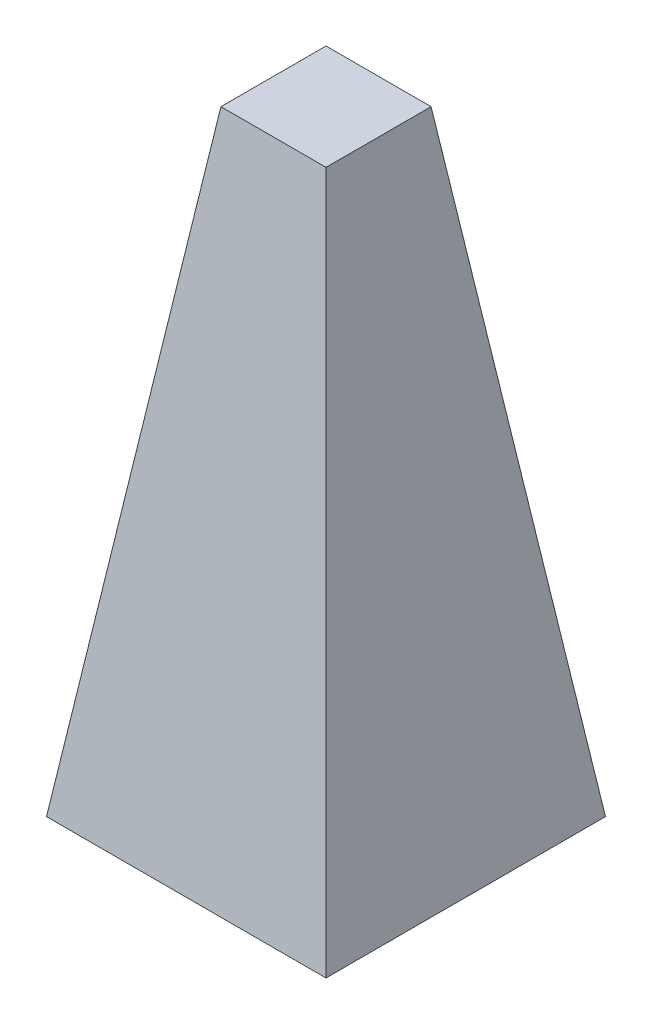
ISO-10303-21;
HEADER;
FILE_DESCRIPTION(('STEP AP214'),'2;1');
FILE_NAME('part.step','',(''),(''),'','','');
FILE_SCHEMA(('AUTOMOTIVE_DESIGN { 1 0 10303 214 1 1 1 1 }'));
ENDSEC;
DATA;
#1=APPLICATION_CONTEXT('core data for automotive mechanical design processes');
#2=APPLICATION_PROTOCOL_DEFINITION('international standard','automotive_design',2000,#1);
#3=PRODUCT_CONTEXT('',#1,'mechanical');
#4=PRODUCT('Part','Part','',(#3));
#5=PRODUCT_RELATED_PRODUCT_CATEGORY('part','',(#4));
#6=PRODUCT_DEFINITION_FORMATION('','',#4);
#7=PRODUCT_DEFINITION_CONTEXT('part definition',#1,'design');
#8=PRODUCT_DEFINITION('design','',#6,#7);
#9=PRODUCT_DEFINITION_SHAPE('','',#8);
#10=(LENGTH_UNIT() NAMED_UNIT(*) SI_UNIT(.MILLI.,.METRE.));
#11=(NAMED_UNIT(*) PLANE_ANGLE_UNIT() SI_UNIT($,.RADIAN.));
#12=(NAMED_UNIT(*) SI_UNIT($,.STERADIAN.) SOLID_ANGLE_UNIT());
#13=UNCERTAINTY_MEASURE_WITH_UNIT(LENGTH_MEASURE(1.E-05),#10,'distance_accuracy_value','');
#14=(GEOMETRIC_REPRESENTATION_CONTEXT(3) GLOBAL_UNCERTAINTY_ASSIGNED_CONTEXT((#13)) GLOBAL_UNIT_ASSIGNED_CONTEXT((#10,
#11,#12)) REPRESENTATION_CONTEXT('',''));
#15=CARTESIAN_POINT('',(0.,0.,0.));
#16=DIRECTION('',(0.,0.,1.));
#17=DIRECTION('',(1.,0.,0.));
#18=AXIS2_PLACEMENT_3D('',#15,#16,#17);
#19=CARTESIAN_POINT('',(0.,279.4,0.));
#20=DIRECTION('',(0.,-1.,0.));
#21=DIRECTION('',(0.,0.,-1.));
#22=AXIS2_PLACEMENT_3D('',#19,#20,#21);
#23=PLANE('',#22);
#24=DIRECTION('',(0.,0.,-1.));
#25=VECTOR('',#24,1.);
#26=CARTESIAN_POINT('',(23.876,279.4,23.876));
#27=LINE('',#26,#25);
#28=CARTESIAN_POINT('',(23.876,279.4,23.876));
#29=VERTEX_POINT('',#28);
#30=CARTESIAN_POINT('',(23.876,279.4,-23.876));
#31=VERTEX_POINT('',#30);
#32=EDGE_CURVE('E231',#29,#31,#27,.T.);
#33=ORIENTED_EDGE('',*,*,#32,.T.);
#34=DIRECTION('',(-1.,0.,0.));
#35=VECTOR('',#34,1.);
#36=CARTESIAN_POINT('',(-23.876,279.4,-23.876));
#37=LINE('',#36,#35);
#38=CARTESIAN_POINT('',(-23.876,279.4,-23.876));
#39=VERTEX_POINT('',#38);
#40=EDGE_CURVE('E225',#31,#39,#37,.T.);
#41=ORIENTED_EDGE('',*,*,#40,.T.);
#42=DIRECTION('',(0.,0.,1.));
#43=VECTOR('',#42,1.);
#44=CARTESIAN_POINT('',(-23.876,279.4,23.876));
#45=LINE('',#44,#43);
#46=CARTESIAN_POINT('',(-23.876,279.4,23.876));
#47=VERTEX_POINT('',#46);
#48=EDGE_CURVE('E60',#39,#47,#45,.T.);
#49=ORIENTED_EDGE('',*,*,#48,.T.);
#50=DIRECTION('',(1.,0.,0.));
#51=VECTOR('',#50,1.);
#52=CARTESIAN_POINT('',(-23.876,279.4,23.876));
#53=LINE('',#52,#51);
#54=EDGE_CURVE('E12',#47,#29,#53,.T.);
#55=ORIENTED_EDGE('',*,*,#54,.T.);
#56=EDGE_LOOP('',(#33,#41,#49,#55));
#57=FACE_BOUND('',#56,.T.);
#58=ADVANCED_FACE('F49',(#57),#23,.F.);
#59=CARTESIAN_POINT('',(0.,0.,0.));
#60=DIRECTION('',(0.,-1.,0.));
#61=DIRECTION('',(0.,0.,-1.));
#62=AXIS2_PLACEMENT_3D('',#59,#60,#61);
#63=PLANE('',#62);
#64=DIRECTION('',(0.,0.,-1.));
#65=VECTOR('',#64,1.);
#66=CARTESIAN_POINT('',(63.5,0.,63.5));
#67=LINE('',#66,#65);
#68=CARTESIAN_POINT('',(63.5,0.,63.5));
#69=VERTEX_POINT('',#68);
#70=CARTESIAN_POINT('',(63.5,0.,-63.5));
#71=VERTEX_POINT('',#70);
#72=EDGE_CURVE('E120',#69,#71,#67,.T.);
#73=ORIENTED_EDGE('',*,*,#72,.F.);
#74=DIRECTION('',(1.,0.,0.));
#75=VECTOR('',#74,1.);
#76=CARTESIAN_POINT('',(-63.5,0.,63.5));
#77=LINE('',#76,#75);
#78=CARTESIAN_POINT('',(-63.5,0.,63.5));
#79=VERTEX_POINT('',#78);
#80=EDGE_CURVE('E102',#79,#69,#77,.T.);
#81=ORIENTED_EDGE('',*,*,#80,.F.);
#82=DIRECTION('',(0.,0.,1.));
#83=VECTOR('',#82,1.);
#84=CARTESIAN_POINT('',(-63.5,0.,63.5));
#85=LINE('',#84,#83);
#86=CARTESIAN_POINT('',(-63.5,0.,-63.5));
#87=VERTEX_POINT('',#86);
#88=EDGE_CURVE('E93',#87,#79,#85,.T.);
#89=ORIENTED_EDGE('',*,*,#88,.F.);
#90=DIRECTION('',(-1.,0.,0.));
#91=VECTOR('',#90,1.);
#92=CARTESIAN_POINT('',(-63.5,0.,-63.5));
#93=LINE('',#92,#91);
#94=EDGE_CURVE('E98',#71,#87,#93,.T.);
#95=ORIENTED_EDGE('',*,*,#94,.F.);
#96=EDGE_LOOP('',(#73,#81,#89,#95));
#97=FACE_BOUND('',#96,.T.);
#98=ADVANCED_FACE('F97',(#97),#63,.T.);
#99=CARTESIAN_POINT('',(0.,8.82790423353122,-62.2480426723356));
#100=DIRECTION('',(0.,-0.140413188225986,0.990092993901186));
#101=DIRECTION('',(0.,-0.990092993901186,-0.140413188225986));
#102=AXIS2_PLACEMENT_3D('',#99,#100,#101);
#103=PLANE('',#102);
#104=DIRECTION('',(0.13904914180307,0.980474717842158,0.13904914180307));
#105=VECTOR('',#104,1.);
#106=CARTESIAN_POINT('',(-63.5,0.,-63.5));
#107=LINE('',#106,#105);
#108=EDGE_CURVE('E115',#87,#39,#107,.T.);
#109=ORIENTED_EDGE('',*,*,#108,.T.);
#110=ORIENTED_EDGE('',*,*,#40,.F.);
#111=DIRECTION('',(-0.13904914180307,0.980474717842158,0.13904914180307));
#112=VECTOR('',#111,1.);
#113=CARTESIAN_POINT('',(63.5,0.,-63.5));
#114=LINE('',#113,#112);
#115=EDGE_CURVE('E118',#71,#31,#114,.T.);
#116=ORIENTED_EDGE('',*,*,#115,.F.);
#117=ORIENTED_EDGE('',*,*,#94,.T.);
#118=EDGE_LOOP('',(#109,#110,#116,#117));
#119=FACE_BOUND('',#118,.T.);
#120=ADVANCED_FACE('F114',(#119),#103,.F.);
#121=CARTESIAN_POINT('',(62.2480426723356,8.82790423353122,0.));
#122=DIRECTION('',(-0.990092993901186,-0.140413188225986,0.));
#123=DIRECTION('',(0.140413188225986,-0.990092993901186,0.));
#124=AXIS2_PLACEMENT_3D('',#121,#122,#123);
#125=PLANE('',#124);
#126=ORIENTED_EDGE('',*,*,#115,.T.);
#127=ORIENTED_EDGE('',*,*,#32,.F.);
#128=DIRECTION('',(-0.13904914180307,0.980474717842158,-0.13904914180307));
#129=VECTOR('',#128,1.);
#130=CARTESIAN_POINT('',(63.5,0.,63.5));
#131=LINE('',#130,#129);
#132=EDGE_CURVE('E238',#69,#29,#131,.T.);
#133=ORIENTED_EDGE('',*,*,#132,.F.);
#134=ORIENTED_EDGE('',*,*,#72,.T.);
#135=EDGE_LOOP('',(#126,#127,#133,#134));
#136=FACE_BOUND('',#135,.T.);
#137=ADVANCED_FACE('F151',(#136),#125,.F.);
#138=CARTESIAN_POINT('',(-62.2480426723356,8.82790423353123,0.));
#139=DIRECTION('',(0.990092993901186,-0.140413188225986,0.));
#140=DIRECTION('',(0.140413188225986,0.990092993901186,0.));
#141=AXIS2_PLACEMENT_3D('',#138,#139,#140);
#142=PLANE('',#141);
#143=DIRECTION('',(0.13904914180307,0.980474717842158,-0.13904914180307));
#144=VECTOR('',#143,1.);
#145=CARTESIAN_POINT('',(-63.5,0.,63.5));
#146=LINE('',#145,#144);
#147=EDGE_CURVE('E75',#79,#47,#146,.T.);
#148=ORIENTED_EDGE('',*,*,#147,.T.);
#149=ORIENTED_EDGE('',*,*,#48,.F.);
#150=ORIENTED_EDGE('',*,*,#108,.F.);
#151=ORIENTED_EDGE('',*,*,#88,.T.);
#152=EDGE_LOOP('',(#148,#149,#150,#151));
#153=FACE_BOUND('',#152,.T.);
#154=ADVANCED_FACE('F124',(#153),#142,.F.);
#155=CARTESIAN_POINT('',(0.,8.82790423353123,62.2480426723356));
#156=DIRECTION('',(0.,-0.140413188225986,-0.990092993901186));
#157=DIRECTION('',(0.,0.990092993901186,-0.140413188225986));
#158=AXIS2_PLACEMENT_3D('',#155,#156,#157);
#159=PLANE('',#158);
#160=ORIENTED_EDGE('',*,*,#132,.T.);
#161=ORIENTED_EDGE('',*,*,#54,.F.);
#162=ORIENTED_EDGE('',*,*,#147,.F.);
#163=ORIENTED_EDGE('',*,*,#80,.T.);
#164=EDGE_LOOP('',(#160,#161,#162,#163));
#165=FACE_BOUND('',#164,.T.);
#166=ADVANCED_FACE('F150',(#165),#159,.F.);
#167=CLOSED_SHELL('',(#58,#98,#120,#137,#154,#166));
#168=MANIFOLD_SOLID_BREP('B2',#167);
#169=ADVANCED_BREP_SHAPE_REPRESENTATION('',(#18,#168),#14);
#170=SHAPE_DEFINITION_REPRESENTATION(#9,#169);
ENDSEC;
END-ISO-10303-21;
